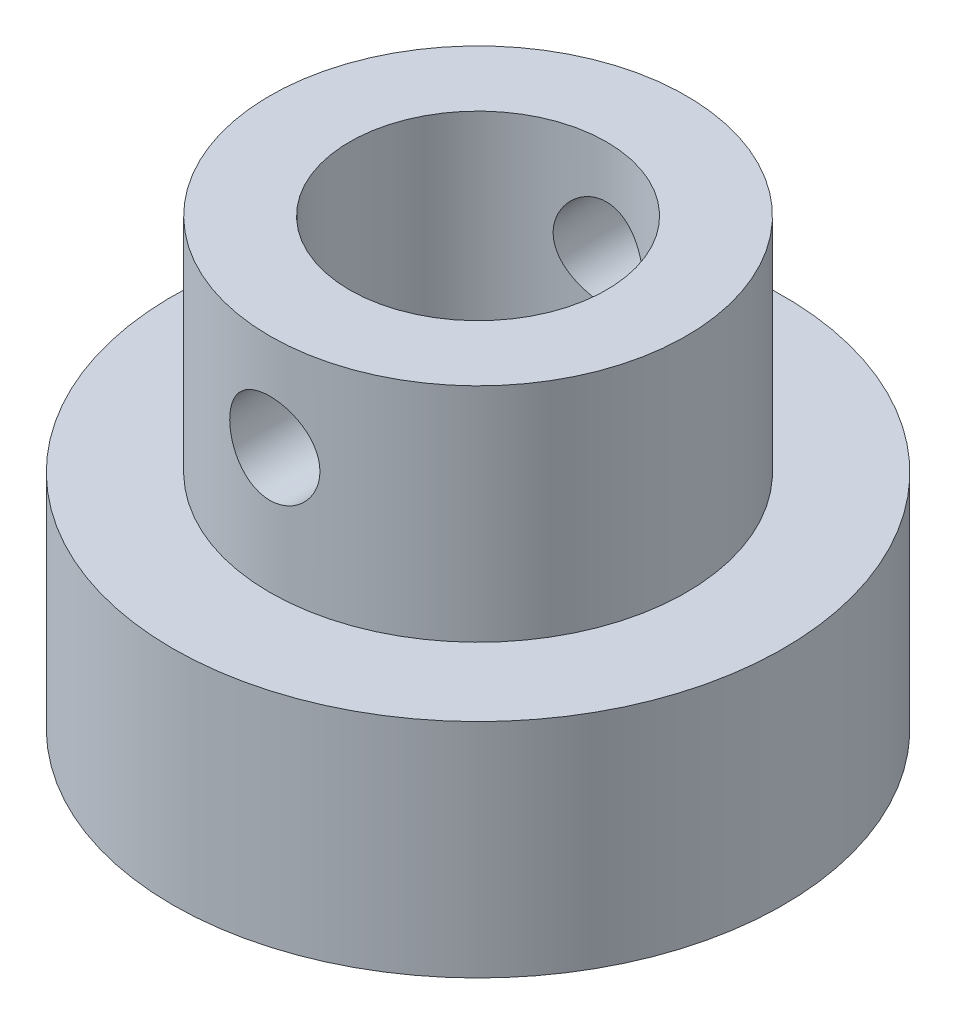
ISO-10303-21;
HEADER;
FILE_DESCRIPTION(('STEP AP214'),'2;1');
FILE_NAME('part.step','',(''),(''),'','','');
FILE_SCHEMA(('AUTOMOTIVE_DESIGN { 1 0 10303 214 1 1 1 1 }'));
ENDSEC;
DATA;
#1=APPLICATION_CONTEXT('core data for automotive mechanical design processes');
#2=APPLICATION_PROTOCOL_DEFINITION('international standard','automotive_design',2000,#1);
#3=PRODUCT_CONTEXT('',#1,'mechanical');
#4=PRODUCT('Part','Part','',(#3));
#5=PRODUCT_RELATED_PRODUCT_CATEGORY('part','',(#4));
#6=PRODUCT_DEFINITION_FORMATION('','',#4);
#7=PRODUCT_DEFINITION_CONTEXT('part definition',#1,'design');
#8=PRODUCT_DEFINITION('design','',#6,#7);
#9=PRODUCT_DEFINITION_SHAPE('','',#8);
#10=(LENGTH_UNIT() NAMED_UNIT(*) SI_UNIT(.MILLI.,.METRE.));
#11=(NAMED_UNIT(*) PLANE_ANGLE_UNIT() SI_UNIT($,.RADIAN.));
#12=(NAMED_UNIT(*) SI_UNIT($,.STERADIAN.) SOLID_ANGLE_UNIT());
#13=UNCERTAINTY_MEASURE_WITH_UNIT(LENGTH_MEASURE(1.E-05),#10,'distance_accuracy_value','');
#14=(GEOMETRIC_REPRESENTATION_CONTEXT(3) GLOBAL_UNCERTAINTY_ASSIGNED_CONTEXT((#13)) GLOBAL_UNIT_ASSIGNED_CONTEXT((#10,
#11,#12)) REPRESENTATION_CONTEXT('',''));
#15=CARTESIAN_POINT('',(0.,0.,0.));
#16=DIRECTION('',(0.,0.,1.));
#17=DIRECTION('',(1.,0.,0.));
#18=AXIS2_PLACEMENT_3D('',#15,#16,#17);
#19=CARTESIAN_POINT('',(0.,8.,0.));
#20=DIRECTION('',(0.,-1.,0.));
#21=DIRECTION('',(0.,0.,-1.));
#22=AXIS2_PLACEMENT_3D('',#19,#20,#21);
#23=CYLINDRICAL_SURFACE('',#22,11.);
#24=CARTESIAN_POINT('',(0.,8.,0.));
#25=DIRECTION('',(0.,1.,0.));
#26=DIRECTION('',(0.,0.,1.));
#27=AXIS2_PLACEMENT_3D('',#24,#25,#26);
#28=CIRCLE('',#27,11.);
#29=CARTESIAN_POINT('',(0.,8.,11.));
#30=VERTEX_POINT('',#29);
#31=EDGE_CURVE('E53',#30,#30,#28,.T.);
#32=ORIENTED_EDGE('',*,*,#31,.F.);
#33=EDGE_LOOP('',(#32));
#34=FACE_BOUND('',#33,.T.);
#35=CARTESIAN_POINT('',(0.,0.,0.));
#36=DIRECTION('',(0.,1.,0.));
#37=DIRECTION('',(0.,0.,1.));
#38=AXIS2_PLACEMENT_3D('',#35,#36,#37);
#39=CIRCLE('',#38,11.);
#40=CARTESIAN_POINT('',(0.,0.,11.));
#41=VERTEX_POINT('',#40);
#42=EDGE_CURVE('E133',#41,#41,#39,.T.);
#43=ORIENTED_EDGE('',*,*,#42,.T.);
#44=EDGE_LOOP('',(#43));
#45=FACE_BOUND('',#44,.T.);
#46=ADVANCED_FACE('F39',(#34,#45),#23,.T.);
#47=CARTESIAN_POINT('',(0.,8.,0.));
#48=DIRECTION('',(0.,1.,0.));
#49=DIRECTION('',(0.,0.,1.));
#50=AXIS2_PLACEMENT_3D('',#47,#48,#49);
#51=PLANE('',#50);
#52=CARTESIAN_POINT('',(0.,8.,0.));
#53=DIRECTION('',(0.,1.,0.));
#54=DIRECTION('',(0.,0.,1.));
#55=AXIS2_PLACEMENT_3D('',#52,#53,#54);
#56=CIRCLE('',#55,7.5);
#57=CARTESIAN_POINT('',(0.,8.,7.5));
#58=VERTEX_POINT('',#57);
#59=EDGE_CURVE('E11',#58,#58,#56,.T.);
#60=ORIENTED_EDGE('',*,*,#59,.F.);
#61=EDGE_LOOP('',(#60));
#62=FACE_BOUND('',#61,.T.);
#63=ORIENTED_EDGE('',*,*,#31,.T.);
#64=EDGE_LOOP('',(#63));
#65=FACE_BOUND('',#64,.T.);
#66=ADVANCED_FACE('F181',(#62,#65),#51,.T.);
#67=CARTESIAN_POINT('',(0.,0.,0.));
#68=DIRECTION('',(0.,1.,0.));
#69=DIRECTION('',(0.,0.,1.));
#70=AXIS2_PLACEMENT_3D('',#67,#68,#69);
#71=PLANE('',#70);
#72=CARTESIAN_POINT('',(0.,0.,8.));
#73=DIRECTION('',(0.,-1.,0.));
#74=DIRECTION('',(0.,0.,-1.));
#75=AXIS2_PLACEMENT_3D('',#72,#73,#74);
#76=CIRCLE('',#75,1.7);
#77=CARTESIAN_POINT('',(0.,0.,6.3));
#78=VERTEX_POINT('',#77);
#79=EDGE_CURVE('E87',#78,#78,#76,.T.);
#80=ORIENTED_EDGE('',*,*,#79,.F.);
#81=EDGE_LOOP('',(#80));
#82=FACE_BOUND('',#81,.T.);
#83=CARTESIAN_POINT('',(-8.,0.,0.));
#84=DIRECTION('',(0.,-1.,0.));
#85=DIRECTION('',(0.,0.,-1.));
#86=AXIS2_PLACEMENT_3D('',#83,#84,#85);
#87=CIRCLE('',#86,1.7);
#88=CARTESIAN_POINT('',(-8.,0.,-1.7));
#89=VERTEX_POINT('',#88);
#90=EDGE_CURVE('E78',#89,#89,#87,.T.);
#91=ORIENTED_EDGE('',*,*,#90,.F.);
#92=EDGE_LOOP('',(#91));
#93=FACE_BOUND('',#92,.T.);
#94=CARTESIAN_POINT('',(0.,0.,-8.));
#95=DIRECTION('',(0.,-1.,0.));
#96=DIRECTION('',(0.,0.,-1.));
#97=AXIS2_PLACEMENT_3D('',#94,#95,#96);
#98=CIRCLE('',#97,1.7);
#99=CARTESIAN_POINT('',(0.,0.,-9.7));
#100=VERTEX_POINT('',#99);
#101=EDGE_CURVE('E98',#100,#100,#98,.T.);
#102=ORIENTED_EDGE('',*,*,#101,.F.);
#103=EDGE_LOOP('',(#102));
#104=FACE_BOUND('',#103,.T.);
#105=CARTESIAN_POINT('',(8.,0.,0.));
#106=DIRECTION('',(0.,-1.,0.));
#107=DIRECTION('',(0.,0.,-1.));
#108=AXIS2_PLACEMENT_3D('',#105,#106,#107);
#109=CIRCLE('',#108,1.7);
#110=CARTESIAN_POINT('',(8.,0.,-1.7));
#111=VERTEX_POINT('',#110);
#112=EDGE_CURVE('E110',#111,#111,#109,.T.);
#113=ORIENTED_EDGE('',*,*,#112,.F.);
#114=EDGE_LOOP('',(#113));
#115=FACE_BOUND('',#114,.T.);
#116=ORIENTED_EDGE('',*,*,#42,.F.);
#117=EDGE_LOOP('',(#116));
#118=FACE_BOUND('',#117,.T.);
#119=ADVANCED_FACE('F179',(#82,#93,#104,#115,#118),#71,.F.);
#120=CARTESIAN_POINT('',(0.,16.,0.));
#121=DIRECTION('',(0.,-1.,0.));
#122=DIRECTION('',(0.,0.,-1.));
#123=AXIS2_PLACEMENT_3D('',#120,#121,#122);
#124=CYLINDRICAL_SURFACE('',#123,7.5);
#125=CARTESIAN_POINT('',(0.,14.125,-7.5));
#126=CARTESIAN_POINT('',(-0.0901479540247242,14.1249968923104,-7.49999833465286));
#127=CARTESIAN_POINT('',(-0.180333653524648,14.1174731454035,-7.49835813423914));
#128=CARTESIAN_POINT('',(-0.358144782911639,14.0876073508536,-7.49197344979723));
#129=CARTESIAN_POINT('',(-0.445768312005207,14.0652545793368,-7.48722671925988));
#130=CARTESIAN_POINT('',(-0.615859531046939,14.0064625843428,-7.47515766036674));
#131=CARTESIAN_POINT('',(-0.698332453767545,13.9700379368545,-7.4678379978208));
#132=CARTESIAN_POINT('',(-0.855993155396568,13.8841820792907,-7.45141372270704));
#133=CARTESIAN_POINT('',(-0.931181150421449,13.8347512552215,-7.44230916311466));
#134=CARTESIAN_POINT('',(-1.07332604077453,13.7234615017073,-7.42315255638508));
#135=CARTESIAN_POINT('',(-1.14015165968553,13.6614368758258,-7.41308894175801));
#136=CARTESIAN_POINT('',(-1.26253675838003,13.5270759447585,-7.39323026224726));
#137=CARTESIAN_POINT('',(-1.31809524854413,13.4547387347426,-7.38343522101833));
#138=CARTESIAN_POINT('',(-1.41694586085904,13.3008383958286,-7.36510879581594));
#139=CARTESIAN_POINT('',(-1.46009866490761,13.2191838590649,-7.35659224138259));
#140=CARTESIAN_POINT('',(-1.53201942872996,13.0495672254001,-7.34195290175129));
#141=CARTESIAN_POINT('',(-1.56078907387586,12.9616058688936,-7.33582983611039));
#142=CARTESIAN_POINT('',(-1.60269387288556,12.7832952251765,-7.32678847076681));
#143=CARTESIAN_POINT('',(-1.61606121788145,12.6930029671636,-7.3238226291454));
#144=CARTESIAN_POINT('',(-1.62750384878042,12.5114124403141,-7.3212886947931));
#145=CARTESIAN_POINT('',(-1.62558097786447,12.4201142940588,-7.32172019252502));
#146=CARTESIAN_POINT('',(-1.60668471401318,12.2408266257476,-7.32588912430294));
#147=CARTESIAN_POINT('',(-1.58998064472992,12.1528071342021,-7.32956739690384));
#148=CARTESIAN_POINT('',(-1.54242266223009,11.9808502530296,-7.33972193616241));
#149=CARTESIAN_POINT('',(-1.51156796851897,11.8969130888508,-7.34619835715415));
#150=CARTESIAN_POINT('',(-1.43633617080431,11.734744232766,-7.36127801218712));
#151=CARTESIAN_POINT('',(-1.39185514512697,11.6565623246642,-7.36989749168467));
#152=CARTESIAN_POINT('',(-1.29070643673813,11.5086724696205,-7.38828204920645));
#153=CARTESIAN_POINT('',(-1.23403712235219,11.4389656592172,-7.39804728053552));
#154=CARTESIAN_POINT('',(-1.10869294700727,11.3084537375133,-7.41787716607823));
#155=CARTESIAN_POINT('',(-1.03978897288967,11.2478687515638,-7.42794377839477));
#156=CARTESIAN_POINT('',(-0.892685343979342,11.1390788160031,-7.44705346585474));
#157=CARTESIAN_POINT('',(-0.814485526906435,11.090874082564,-7.45609652312429));
#158=CARTESIAN_POINT('',(-0.650744094858933,11.0081601843631,-7.47216868583004));
#159=CARTESIAN_POINT('',(-0.565187684503572,10.9736794432215,-7.47919360323694));
#160=CARTESIAN_POINT('',(-0.389309359280253,10.9196446170939,-7.49040677210774));
#161=CARTESIAN_POINT('',(-0.29898812608197,10.9000884031188,-7.49459542815571));
#162=CARTESIAN_POINT('',(-0.118032605514446,10.8767769569225,-7.49960668074752));
#163=CARTESIAN_POINT('',(-0.0274387859048244,10.8727209690694,-7.50049333820621));
#164=CARTESIAN_POINT('',(0.153131946389313,10.8797105205614,-7.49898002686768));
#165=CARTESIAN_POINT('',(0.24310889969126,10.8907550558289,-7.49658027659322));
#166=CARTESIAN_POINT('',(0.41889827958432,10.9273826917776,-7.48880417809933));
#167=CARTESIAN_POINT('',(0.504745045285521,10.9528084357412,-7.48346006275669));
#168=CARTESIAN_POINT('',(0.670955437352065,11.0173023954218,-7.47039323254991));
#169=CARTESIAN_POINT('',(0.751318601981769,11.0563717582821,-7.46267031768488));
#170=CARTESIAN_POINT('',(0.905527035036078,11.1476732875241,-7.44554432718735));
#171=CARTESIAN_POINT('',(0.979264892547599,11.2000826384609,-7.43611917472359));
#172=CARTESIAN_POINT('',(1.11700721488751,11.316342669268,-7.41667999768088));
#173=CARTESIAN_POINT('',(1.18101043901943,11.3801948052865,-7.40666589826476));
#174=CARTESIAN_POINT('',(1.29865253183392,11.5189067808595,-7.38695681521904));
#175=CARTESIAN_POINT('',(1.35208333703318,11.5939445985842,-7.37727086146894));
#176=CARTESIAN_POINT('',(1.44558524361963,11.7521054284889,-7.35952154796309));
#177=CARTESIAN_POINT('',(1.4856569192304,11.8352280929546,-7.35145811847132));
#178=CARTESIAN_POINT('',(1.55103509163125,12.0067555352912,-7.33794287614403));
#179=CARTESIAN_POINT('',(1.57642400202934,12.0951276985389,-7.33247651761262));
#180=CARTESIAN_POINT('',(1.61195844891764,12.2750172805246,-7.32474755019285));
#181=CARTESIAN_POINT('',(1.62210637050298,12.3665342048388,-7.32248444002445));
#182=CARTESIAN_POINT('',(1.62677075530336,12.5480186851911,-7.3214493720842));
#183=CARTESIAN_POINT('',(1.62161697678218,12.6379775033783,-7.32260376409825));
#184=CARTESIAN_POINT('',(1.59656038496706,12.815712333774,-7.32810729341865));
#185=CARTESIAN_POINT('',(1.57665773876875,12.9034883707003,-7.3324563945309));
#186=CARTESIAN_POINT('',(1.52282633194366,13.0741099996105,-7.34382373878036));
#187=CARTESIAN_POINT('',(1.4889447033154,13.1569710993366,-7.35083300650847));
#188=CARTESIAN_POINT('',(1.40815791883712,13.3158820491978,-7.36673460516187));
#189=CARTESIAN_POINT('',(1.36125143558819,13.3919312040635,-7.37562712799295));
#190=CARTESIAN_POINT('',(1.2546489870959,13.5366869780595,-7.39451389328671));
#191=CARTESIAN_POINT('',(1.19471765092078,13.6052178999174,-7.40452649979151));
#192=CARTESIAN_POINT('',(1.0642447649264,13.7313583997511,-7.42440093275769));
#193=CARTESIAN_POINT('',(0.993700768039403,13.7889654519575,-7.43426272386478));
#194=CARTESIAN_POINT('',(0.84292761338998,13.8923210921052,-7.45287255955798));
#195=CARTESIAN_POINT('',(0.762587011653083,13.9379100890078,-7.46160489997197));
#196=CARTESIAN_POINT('',(0.595211940972629,14.0148652197655,-7.47681476384854));
#197=CARTESIAN_POINT('',(0.508183207342466,14.0462433841878,-7.48329419349057));
#198=CARTESIAN_POINT('',(0.350878919189541,14.0882382204436,-7.49210029764606));
#199=CARTESIAN_POINT('',(0.281459740955777,14.1019977844806,-7.49504445374658));
#200=CARTESIAN_POINT('',(0.141368077133739,14.1203796974869,-7.49899491649603));
#201=CARTESIAN_POINT('',(0.0706956452593545,14.125002437106,-7.50000130599515));
#202=CARTESIAN_POINT('',(0.,14.125,-7.5));
#203=B_SPLINE_CURVE_WITH_KNOTS('',3,(#125,#126,#127,#128,#129,#130,#131,#132,#133,#134,#135,
#136,#137,#138,#139,#140,#141,#142,#143,#144,#145,#146,#147,#148,#149,#150,#151,#152,#153,#154,
#155,#156,#157,#158,#159,#160,#161,#162,#163,#164,#165,#166,#167,#168,#169,#170,#171,#172,#173,
#174,#175,#176,#177,#178,#179,#180,#181,#182,#183,#184,#185,#186,#187,#188,#189,#190,#191,#192,
#193,#194,#195,#196,#197,#198,#199,#200,#201,#202),.UNSPECIFIED.,.T.,.F.,(4,2,2,2,2,2,2,2,2,2,2,
2,2,2,2,2,2,2,2,2,2,2,2,2,2,2,2,2,2,2,2,2,2,2,2,2,2,2,4),(0.,0.270185104747787,
0.540565811976368,0.8106672000257,1.08076057272556,1.35466930002996,1.62860207499659,
1.90550066624898,2.18236680380904,2.45500217917843,2.7276046898245,2.99534017891215,
3.26309043704611,3.53293580122647,3.80281731274124,4.07842213995422,4.35403177918597,
4.63020929700403,4.90634741063436,5.17709949540208,5.44783357795425,5.71566110213552,
5.98351115043831,6.25512359403709,6.52677062617235,6.80332376875751,7.07986502255779,
7.35483861007376,7.62976916189603,7.89881814654413,8.16786408307853,8.43601021382995,
8.70418368212996,8.97767995016378,9.25123937790989,9.52826678977587,9.80505923612806,
10.016952309559,10.2288363231926),.UNSPECIFIED.);
#204=CARTESIAN_POINT('',(0.,14.125,-7.5));
#205=VERTEX_POINT('',#204);
#206=EDGE_CURVE('E42',#205,#205,#203,.T.);
#207=ORIENTED_EDGE('',*,*,#206,.T.);
#208=EDGE_LOOP('',(#207));
#209=FACE_BOUND('',#208,.T.);
#210=CARTESIAN_POINT('',(-1.625,12.5,7.32184232280374));
#211=CARTESIAN_POINT('',(-1.62499687209214,12.5901199556067,7.32184414375208));
#212=CARTESIAN_POINT('',(-1.61747763928133,12.6802777072396,7.32352428607456));
#213=CARTESIAN_POINT('',(-1.58763139826009,12.8580308212321,7.33005125182243));
#214=CARTESIAN_POINT('',(-1.56529355435126,12.9456242595347,7.33490039245132));
#215=CARTESIAN_POINT('',(-1.50654519463478,13.1156517233168,7.34719096792699));
#216=CARTESIAN_POINT('',(-1.47014995445549,13.1980912367735,7.35462958802347));
#217=CARTESIAN_POINT('',(-1.38436343523498,13.3556955272207,7.37125759440614));
#218=CARTESIAN_POINT('',(-1.3349724756991,13.4308604829972,7.38044693764852));
#219=CARTESIAN_POINT('',(-1.22372374982819,13.5730295804188,7.39971118281315));
#220=CARTESIAN_POINT('',(-1.16169132615172,13.6398955641599,7.40979723204462));
#221=CARTESIAN_POINT('',(-1.02729762080912,13.7623590830841,7.42962079535388));
#222=CARTESIAN_POINT('',(-0.954935546298752,13.8179557525065,7.43935828260625));
#223=CARTESIAN_POINT('',(-0.801011635174219,13.9168477758399,7.45750883541628));
#224=CARTESIAN_POINT('',(-0.719362661039211,13.9600104287561,7.46590721513039));
#225=CARTESIAN_POINT('',(-0.549758031104518,14.0319509127924,7.48030744520595));
#226=CARTESIAN_POINT('',(-0.461803070725259,14.060730327306,7.4863095593481));
#227=CARTESIAN_POINT('',(-0.283519405794788,14.1026533711496,7.49516221130164));
#228=CARTESIAN_POINT('',(-0.19324804760359,14.1160307668407,7.49805981981853));
#229=CARTESIAN_POINT('',(-0.0116989907791744,14.1275007517177,7.50054000524574));
#230=CARTESIAN_POINT('',(0.0795785936471376,14.1255950580587,7.50012295457977));
#231=CARTESIAN_POINT('',(0.258938141487593,14.106727429218,7.49605684280341));
#232=CARTESIAN_POINT('',(0.34704801518035,14.0900174455468,7.49246186845644));
#233=CARTESIAN_POINT('',(0.519182539878094,14.0424168515449,7.48250539784684));
#234=CARTESIAN_POINT('',(0.603207008276534,14.0115256079936,7.47614377804881));
#235=CARTESIAN_POINT('',(0.765487195860258,13.9362153238536,7.46128158969121));
#236=CARTESIAN_POINT('',(0.843696987273928,13.8917004152657,7.45276593964814));
#237=CARTESIAN_POINT('',(0.99162854432123,13.7904778401247,7.43452999336579));
#238=CARTESIAN_POINT('',(1.06134917195807,13.7337685416908,7.42480953597031));
#239=CARTESIAN_POINT('',(1.19182140210426,13.6083940626952,7.40499910922728));
#240=CARTESIAN_POINT('',(1.25236076193675,13.5395083704295,7.39490564770127));
#241=CARTESIAN_POINT('',(1.36106708879127,13.392458210296,7.37567304351349));
#242=CARTESIAN_POINT('',(1.40923373303013,13.3142935004323,7.36653392575261));
#243=CARTESIAN_POINT('',(1.49191924639667,13.150565349079,7.35023580998224));
#244=CARTESIAN_POINT('',(1.52639866246812,13.0649813733747,7.34308255372838));
#245=CARTESIAN_POINT('',(1.58042258184931,12.889042607875,7.33164612434379));
#246=CARTESIAN_POINT('',(1.5999694052511,12.7986885615435,7.32736250536733));
#247=CARTESIAN_POINT('',(1.62324543647323,12.6177120345439,7.32224110981487));
#248=CARTESIAN_POINT('',(1.62728339582283,12.5271311204803,7.32133608237376));
#249=CARTESIAN_POINT('',(1.62026240642683,12.3465903681749,7.32289302987793));
#250=CARTESIAN_POINT('',(1.60920447383651,12.2566304885388,7.32535477819421));
#251=CARTESIAN_POINT('',(1.57257328406887,12.0809562396314,7.33330445424626));
#252=CARTESIAN_POINT('',(1.54716950166002,11.9952047846305,7.33875702865016));
#253=CARTESIAN_POINT('',(1.48275097137457,11.8291754097126,7.35204219861836));
#254=CARTESIAN_POINT('',(1.44373494087958,11.7488980064422,7.35987501845305));
#255=CARTESIAN_POINT('',(1.35251707971616,11.5947576898493,7.37718625172041));
#256=CARTESIAN_POINT('',(1.30012471092914,11.5210101813298,7.38668776621061));
#257=CARTESIAN_POINT('',(1.18389124648282,11.3832406152174,7.40620460560324));
#258=CARTESIAN_POINT('',(1.12004875703517,11.3192197433728,7.41621999295177));
#259=CARTESIAN_POINT('',(0.981331413697757,11.2015255245566,7.43585739156174));
#260=CARTESIAN_POINT('',(0.906276389126764,11.1480624792713,7.44546887979737));
#261=CARTESIAN_POINT('',(0.74807118723432,11.0545040368504,7.46302313313436));
#262=CARTESIAN_POINT('',(0.664921384330292,11.014408021813,7.47096597536398));
#263=CARTESIAN_POINT('',(0.493399922527268,10.9490162573277,7.48424355636439));
#264=CARTESIAN_POINT('',(0.405064938092908,10.9236277723561,7.48959460133612));
#265=CARTESIAN_POINT('',(0.225254895334082,10.888081634183,7.49715611089188));
#266=CARTESIAN_POINT('',(0.133780286375393,10.8779218105674,7.49936702301052));
#267=CARTESIAN_POINT('',(-0.0477145653661606,10.873217446055,7.50038617714046));
#268=CARTESIAN_POINT('',(-0.13772642281868,10.878358672771,7.49926289364016));
#269=CARTESIAN_POINT('',(-0.315570717122539,10.9034086285368,7.49388626533173));
#270=CARTESIAN_POINT('',(-0.403403191702777,10.9233171017554,7.48963297474859));
#271=CARTESIAN_POINT('',(-0.574157800182041,10.9771870401124,7.47847894809863));
#272=CARTESIAN_POINT('',(-0.657094324974581,11.0111047077401,7.47158646789262));
#273=CARTESIAN_POINT('',(-0.816141464560759,11.0919872321336,7.45589075741551));
#274=CARTESIAN_POINT('',(-0.892251429341775,11.1389533296062,7.44708734546135));
#275=CARTESIAN_POINT('',(-1.03702016526194,11.2456281807887,7.42832569731547));
#276=CARTESIAN_POINT('',(-1.10551339879053,11.3055583560667,7.418348977639));
#277=CARTESIAN_POINT('',(-1.23157840728762,11.4360125681303,7.39846585871692));
#278=CARTESIAN_POINT('',(-1.28914755197976,11.5065391489877,7.38855947695841));
#279=CARTESIAN_POINT('',(-1.39245374978007,11.6572920448323,7.36979460227812));
#280=CARTESIAN_POINT('',(-1.43802639033545,11.737633048104,7.36095149094263));
#281=CARTESIAN_POINT('',(-1.51495083643342,11.905007191765,7.34550714239166));
#282=CARTESIAN_POINT('',(-1.54631477727316,11.9920345469142,7.33890399329569));
#283=CARTESIAN_POINT('',(-1.58827656632666,12.1493028810386,7.32991922087132));
#284=CARTESIAN_POINT('',(-1.6020216496014,12.2186854639203,7.3269103320858));
#285=CARTESIAN_POINT('',(-1.62038437850148,12.3587043254918,7.32287121561378));
#286=CARTESIAN_POINT('',(-1.62500245246751,12.42934054519,7.32184089507093));
#287=CARTESIAN_POINT('',(-1.625,12.5,7.32184232280374));
#288=B_SPLINE_CURVE_WITH_KNOTS('',3,(#210,#211,#212,#213,#214,#215,#216,#217,#218,#219,#220,
#221,#222,#223,#224,#225,#226,#227,#228,#229,#230,#231,#232,#233,#234,#235,#236,#237,#238,#239,
#240,#241,#242,#243,#244,#245,#246,#247,#248,#249,#250,#251,#252,#253,#254,#255,#256,#257,#258,
#259,#260,#261,#262,#263,#264,#265,#266,#267,#268,#269,#270,#271,#272,#273,#274,#275,#276,#277,
#278,#279,#280,#281,#282,#283,#284,#285,#286,#287),.UNSPECIFIED.,.T.,.F.,(4,2,2,2,2,2,2,2,2,2,2,
2,2,2,2,2,2,2,2,2,2,2,2,2,2,2,2,2,2,2,2,2,2,2,2,2,2,2,4),(0.,0.270100933639585,
0.540399589117663,0.81040534414459,1.0804044615842,1.35442330510247,1.62846319204188,
1.90532771132165,2.18216174497129,2.45473627707221,2.727280184069,2.99527295394262,
3.26327769137584,3.53321348178312,3.80318541811235,4.07867071434198,4.35416319678653,
4.6304441107928,4.90668209001818,5.17739130544218,5.44808229941638,5.71564044210779,
5.98322380236158,6.25485499432266,6.52651927359209,6.80314434725372,7.07975663192012,
7.35460525468541,7.6294147018405,7.89861968626967,8.16782000703734,8.4361850108691,
8.70457554086096,8.97797416466241,9.25143853344364,9.52847570509277,9.80527581803337,
10.0170611028616,10.2288364481351),.UNSPECIFIED.);
#289=CARTESIAN_POINT('',(-1.625,12.5,7.32184232280374));
#290=VERTEX_POINT('',#289);
#291=EDGE_CURVE('E148',#290,#290,#288,.T.);
#292=ORIENTED_EDGE('',*,*,#291,.T.);
#293=EDGE_LOOP('',(#292));
#294=FACE_BOUND('',#293,.T.);
#295=CARTESIAN_POINT('',(0.,16.,0.));
#296=DIRECTION('',(0.,1.,0.));
#297=DIRECTION('',(0.,0.,1.));
#298=AXIS2_PLACEMENT_3D('',#295,#296,#297);
#299=CIRCLE('',#298,7.5);
#300=CARTESIAN_POINT('',(0.,16.,7.5));
#301=VERTEX_POINT('',#300);
#302=EDGE_CURVE('E127',#301,#301,#299,.T.);
#303=ORIENTED_EDGE('',*,*,#302,.F.);
#304=EDGE_LOOP('',(#303));
#305=FACE_BOUND('',#304,.T.);
#306=ORIENTED_EDGE('',*,*,#59,.T.);
#307=EDGE_LOOP('',(#306));
#308=FACE_BOUND('',#307,.T.);
#309=ADVANCED_FACE('F174',(#209,#294,#305,#308),#124,.T.);
#310=CARTESIAN_POINT('',(0.,16.,0.));
#311=DIRECTION('',(0.,1.,0.));
#312=DIRECTION('',(0.,0.,1.));
#313=AXIS2_PLACEMENT_3D('',#310,#311,#312);
#314=PLANE('',#313);
#315=CARTESIAN_POINT('',(0.,16.,0.));
#316=DIRECTION('',(0.,1.,0.));
#317=DIRECTION('',(0.,0.,1.));
#318=AXIS2_PLACEMENT_3D('',#315,#316,#317);
#319=CIRCLE('',#318,4.625);
#320=CARTESIAN_POINT('',(0.,16.,4.625));
#321=VERTEX_POINT('',#320);
#322=EDGE_CURVE('E122',#321,#321,#319,.T.);
#323=ORIENTED_EDGE('',*,*,#322,.F.);
#324=EDGE_LOOP('',(#323));
#325=FACE_BOUND('',#324,.T.);
#326=ORIENTED_EDGE('',*,*,#302,.T.);
#327=EDGE_LOOP('',(#326));
#328=FACE_BOUND('',#327,.T.);
#329=ADVANCED_FACE('F178',(#325,#328),#314,.T.);
#330=CARTESIAN_POINT('',(0.,8.,0.));
#331=DIRECTION('',(0.,1.,0.));
#332=DIRECTION('',(0.,0.,1.));
#333=AXIS2_PLACEMENT_3D('',#330,#331,#332);
#334=CYLINDRICAL_SURFACE('',#333,4.625);
#335=CARTESIAN_POINT('',(1.625,12.5,-4.33012701892219));
#336=CARTESIAN_POINT('',(1.62500150829733,12.4118027863263,-4.33012573284073));
#337=CARTESIAN_POINT('',(1.61779548336245,12.3236160731502,-4.33285104282251));
#338=CARTESIAN_POINT('',(1.58927299575478,12.149874885696,-4.3433930621808));
#339=CARTESIAN_POINT('',(1.56795545162227,12.0643206136853,-4.35121016177433));
#340=CARTESIAN_POINT('',(1.51206700335383,11.8983936526935,-4.37094334062911));
#341=CARTESIAN_POINT('',(1.47752444467068,11.8180103082039,-4.38285064768964));
#342=CARTESIAN_POINT('',(1.39626497313055,11.664150970291,-4.40940926548112));
#343=CARTESIAN_POINT('',(1.34954493280841,11.5906767579021,-4.42406128084572));
#344=CARTESIAN_POINT('',(1.24307820181164,11.4495229988598,-4.45517344672579));
#345=CARTESIAN_POINT('',(1.18288940085755,11.3821875421975,-4.4716821892838));
#346=CARTESIAN_POINT('',(1.05213491319957,11.2583281251141,-4.50423928506704));
#347=CARTESIAN_POINT('',(0.981567347426518,11.2018061267355,-4.52028755429374));
#348=CARTESIAN_POINT('',(0.82950227710956,11.0995768954727,-4.55068434918393));
#349=CARTESIAN_POINT('',(0.74774473132286,11.0542358402988,-4.56496914900983));
#350=CARTESIAN_POINT('',(0.577173587360306,10.9780897413938,-4.58965216808301));
#351=CARTESIAN_POINT('',(0.488362126347126,10.9472803144174,-4.60005155910798));
#352=CARTESIAN_POINT('',(0.309816097877116,10.9022555183571,-4.61544755230239));
#353=CARTESIAN_POINT('',(0.220247335749104,10.887449470965,-4.6206359300531));
#354=CARTESIAN_POINT('',(0.039756348707931,10.8729675177362,-4.62570919054418));
#355=CARTESIAN_POINT('',(-0.0511654819801261,10.873287287953,-4.62559558893667));
#356=CARTESIAN_POINT('',(-0.227578769223165,10.8886860433862,-4.62020432989997));
#357=CARTESIAN_POINT('',(-0.313134365157233,10.9031221887032,-4.61515159697674));
#358=CARTESIAN_POINT('',(-0.48052073596718,10.9452732071685,-4.60073748556916));
#359=CARTESIAN_POINT('',(-0.56235125188061,10.9729890019609,-4.59137580803404));
#360=CARTESIAN_POINT('',(-0.721300530579032,11.0412548831078,-4.56912305860148));
#361=CARTESIAN_POINT('',(-0.79833850377761,11.0819771222662,-4.55618497777778));
#362=CARTESIAN_POINT('',(-0.944668447950634,11.1749540180038,-4.52811063452626));
#363=CARTESIAN_POINT('',(-1.01395809737558,11.2272121170788,-4.51297371639026));
#364=CARTESIAN_POINT('',(-1.14663532629142,11.3449583839262,-4.48115483226846));
#365=CARTESIAN_POINT('',(-1.20952949469725,11.4109927000639,-4.46443345217924));
#366=CARTESIAN_POINT('',(-1.3235221092173,11.5527976907646,-4.4319787221418));
#367=CARTESIAN_POINT('',(-1.37461829262161,11.6285702286697,-4.41624556214265));
#368=CARTESIAN_POINT('',(-1.46435277059678,11.7894229226137,-4.38731873128432));
#369=CARTESIAN_POINT('',(-1.50275910964837,11.8746419583107,-4.37417394984031));
#370=CARTESIAN_POINT('',(-1.56450027209022,12.050918702227,-4.35247603204309));
#371=CARTESIAN_POINT('',(-1.58784226395531,12.1419736106952,-4.34392071209017));
#372=CARTESIAN_POINT('',(-1.61773856551961,12.3225145245676,-4.33287316706974));
#373=CARTESIAN_POINT('',(-1.62506609618441,12.4118553792491,-4.33010198886669));
#374=CARTESIAN_POINT('',(-1.62493304045104,12.5905138882046,-4.33015237293203));
#375=CARTESIAN_POINT('',(-1.61747553775005,12.6798315434314,-4.33297276897228));
#376=CARTESIAN_POINT('',(-1.58868179004291,12.8522090440491,-4.3436081454417));
#377=CARTESIAN_POINT('',(-1.56790735420756,12.9353766050932,-4.35122073126549));
#378=CARTESIAN_POINT('',(-1.51375717651186,13.0970204703768,-4.37035273497134));
#379=CARTESIAN_POINT('',(-1.48037904951589,13.1754958834112,-4.38187289228429));
#380=CARTESIAN_POINT('',(-1.40067357955318,13.3285135222489,-4.40800977309429));
#381=CARTESIAN_POINT('',(-1.35394153478346,13.402828677838,-4.42271911494206));
#382=CARTESIAN_POINT('',(-1.24930133840496,13.5428399851722,-4.45340766086769));
#383=CARTESIAN_POINT('',(-1.19138954758122,13.6085333186247,-4.46938727744453));
#384=CARTESIAN_POINT('',(-1.0622985721696,13.7331353349432,-4.50186689221156));
#385=CARTESIAN_POINT('',(-0.990569064615989,13.7914806054164,-4.51834791696491));
#386=CARTESIAN_POINT('',(-0.837930397044871,13.8953557719718,-4.54912635757182));
#387=CARTESIAN_POINT('',(-0.757021439586266,13.940885950762,-4.56342382159271));
#388=CARTESIAN_POINT('',(-0.588599426354339,14.01745899056,-4.58817739365169));
#389=CARTESIAN_POINT('',(-0.501125646300484,14.048581097407,-4.59865444499624));
#390=CARTESIAN_POINT('',(-0.321739492001587,14.0955233809401,-4.61467247734998));
#391=CARTESIAN_POINT('',(-0.22982893557763,14.1113497695954,-4.62021546213327));
#392=CARTESIAN_POINT('',(-0.0493045944378566,14.1266445657859,-4.62557313865554));
#393=CARTESIAN_POINT('',(0.039233307935331,14.1269179383006,-4.62566971347605));
#394=CARTESIAN_POINT('',(0.215035401967487,14.1131202441142,-4.62083489224877));
#395=CARTESIAN_POINT('',(0.302299716146434,14.0990505665733,-4.61590398312535));
#396=CARTESIAN_POINT('',(0.471387976522467,14.0575156145694,-4.60168299615926));
#397=CARTESIAN_POINT('',(0.55328434531012,14.0303136361436,-4.59247873038462));
#398=CARTESIAN_POINT('',(0.711372937040097,13.9635370547998,-4.57066166806));
#399=CARTESIAN_POINT('',(0.787564094471202,13.9239601478354,-4.55804823682826));
#400=CARTESIAN_POINT('',(0.935353363106007,13.8317732870271,-4.53007941210145));
#401=CARTESIAN_POINT('',(1.00665289573363,13.7787118899912,-4.51463567543478));
#402=CARTESIAN_POINT('',(1.13959348823396,13.6618057728079,-4.48292657581442));
#403=CARTESIAN_POINT('',(1.20123128562237,13.5979574252808,-4.46666093776994));
#404=CARTESIAN_POINT('',(1.31592123536035,13.4578778385029,-4.43426319908982));
#405=CARTESIAN_POINT('',(1.36846509454748,13.3812200170416,-4.41816972071051));
#406=CARTESIAN_POINT('',(1.45990963153282,13.2196536224754,-4.38880458419607));
#407=CARTESIAN_POINT('',(1.49881191872771,13.1347460241679,-4.37553259326208));
#408=CARTESIAN_POINT('',(1.56136713686403,12.959696668832,-4.35360276246166));
#409=CARTESIAN_POINT('',(1.58514296626991,12.8696037541438,-4.34490783768646));
#410=CARTESIAN_POINT('',(1.61695499172734,12.686335698566,-4.33317194173853));
#411=CARTESIAN_POINT('',(1.62499840679793,12.5931619913058,-4.33012837739947));
#412=CARTESIAN_POINT('',(1.625,12.5,-4.33012701892219));
#413=B_SPLINE_CURVE_WITH_KNOTS('',3,(#335,#336,#337,#338,#339,#340,#341,#342,#343,#344,#345,
#346,#347,#348,#349,#350,#351,#352,#353,#354,#355,#356,#357,#358,#359,#360,#361,#362,#363,#364,
#365,#366,#367,#368,#369,#370,#371,#372,#373,#374,#375,#376,#377,#378,#379,#380,#381,#382,#383,
#384,#385,#386,#387,#388,#389,#390,#391,#392,#393,#394,#395,#396,#397,#398,#399,#400,#401,#402,
#403,#404,#405,#406,#407,#408,#409,#410,#411,#412),.UNSPECIFIED.,.T.,.F.,(4,2,2,2,2,2,2,2,2,2,2,
2,2,2,2,2,2,2,2,2,2,2,2,2,2,2,2,2,2,2,2,2,2,2,2,2,2,2,4),(0.,0.264245837452711,0.52851192816904,
0.792214754247278,1.05598537229117,1.33018771862669,1.60443977038437,1.8867425756752,
2.16896017406029,2.44036249486301,2.7116872316253,2.97120550813731,3.23074179853756,
3.4938665235483,3.75706987583152,4.03394261336656,4.31086840769761,4.59260723212708,
4.87421189012317,5.14188831318889,5.40950891316822,5.66652218607347,5.92358412083283,
6.18945876398179,6.45542010064761,6.7358481529141,7.01627001830062,7.29513065503165,
7.57387799191529,7.83818455852746,8.10246552882103,8.36165497378583,8.62089270513021,
8.89032816299377,9.1598544062153,9.4414544076357,9.72302117544445,10.0022700468936,
10.2813907513464),.UNSPECIFIED.);
#414=CARTESIAN_POINT('',(1.625,12.5,-4.33012701892219));
#415=VERTEX_POINT('',#414);
#416=EDGE_CURVE('E149',#415,#415,#413,.T.);
#417=ORIENTED_EDGE('',*,*,#416,.T.);
#418=EDGE_LOOP('',(#417));
#419=FACE_BOUND('',#418,.T.);
#420=CARTESIAN_POINT('',(0.,10.875,4.625));
#421=CARTESIAN_POINT('',(0.0883877325388629,10.8749985421762,4.6250010281741));
#422=CARTESIAN_POINT('',(0.176765053436674,10.8822345529301,4.6224434236109));
#423=CARTESIAN_POINT('',(0.350900175895998,10.9108869950838,4.61249401019552));
#424=CARTESIAN_POINT('',(0.436657986904093,10.9323033753394,4.60510221877873));
#425=CARTESIAN_POINT('',(0.603018513085195,10.9884803629309,4.58628357271038));
#426=CARTESIAN_POINT('',(0.683630114752264,11.0232171991101,4.57486390893483));
#427=CARTESIAN_POINT('',(0.837880828690709,11.1049359297864,4.54914313038684));
#428=CARTESIAN_POINT('',(0.911518334312613,11.1519206365634,4.53484135401303));
#429=CARTESIAN_POINT('',(1.05252676209618,11.2586709895661,4.50424228642389));
#430=CARTESIAN_POINT('',(1.11959687219141,11.3188190980072,4.48789344365499));
#431=CARTESIAN_POINT('',(1.24293329501787,11.4493764279269,4.45531354339639));
#432=CARTESIAN_POINT('',(1.29919686067978,11.519788250505,4.43908251686238));
#433=CARTESIAN_POINT('',(1.40112094810134,11.6716786193375,4.40799536965322));
#434=CARTESIAN_POINT('',(1.44637632663152,11.7534429688991,4.39320126763134));
#435=CARTESIAN_POINT('',(1.52236246939645,11.9240253807665,4.36745452770202));
#436=CARTESIAN_POINT('',(1.5530982330494,12.0128410028448,4.3565005678859));
#437=CARTESIAN_POINT('',(1.59801916859705,12.1915641350614,4.34022062346786));
#438=CARTESIAN_POINT('',(1.61277267985453,12.2813107044813,4.33470205955729));
#439=CARTESIAN_POINT('',(1.62708747859635,12.4621621857223,4.32935046507901));
#440=CARTESIAN_POINT('',(1.62665409531895,12.5532666098409,4.32951544009839));
#441=CARTESIAN_POINT('',(1.61104582690801,12.7292583847184,4.33534464956135));
#442=CARTESIAN_POINT('',(1.59663141667715,12.8142242534589,4.34072518306266));
#443=CARTESIAN_POINT('',(1.55471780851389,12.9804442696268,4.35591198762353));
#444=CARTESIAN_POINT('',(1.52721687907753,13.061697924324,4.36571884433005));
#445=CARTESIAN_POINT('',(1.45944750990326,13.2198394764183,4.38884202102647));
#446=CARTESIAN_POINT('',(1.41896571786456,13.296627099159,4.4022163088088));
#447=CARTESIAN_POINT('',(1.32653200733796,13.4425515127073,4.43094519985698));
#448=CARTESIAN_POINT('',(1.27457649065293,13.5116858932002,4.44630042372126));
#449=CARTESIAN_POINT('',(1.15709043176051,13.6445889188557,4.47835682722401));
#450=CARTESIAN_POINT('',(1.09094414242737,13.7078081261181,4.49508423103834));
#451=CARTESIAN_POINT('',(0.948787235062726,13.8224084471804,4.52722123409723));
#452=CARTESIAN_POINT('',(0.872775450620443,13.873788159184,4.54263067715955));
#453=CARTESIAN_POINT('',(0.711781590844675,13.963760097115,4.57063875345481));
#454=CARTESIAN_POINT('',(0.626702170613625,14.002190203254,4.58320114958418));
#455=CARTESIAN_POINT('',(0.450736999333407,14.0640167110544,4.60383454476331));
#456=CARTESIAN_POINT('',(0.35985351454505,14.0874189415313,4.61190728503899));
#457=CARTESIAN_POINT('',(0.179500129224028,14.1175174528627,4.62235590790403));
#458=CARTESIAN_POINT('',(0.0901684295156599,14.1249550468276,4.62498437515387));
#459=CARTESIAN_POINT('',(-0.0884937421057299,14.1250445219006,4.6250154733505));
#460=CARTESIAN_POINT('',(-0.177824211014929,14.1176992175455,4.62241909906221));
#461=CARTESIAN_POINT('',(-0.350882406271028,14.0890089964267,4.61245919011675));
#462=CARTESIAN_POINT('',(-0.434697784594169,14.0681318715379,4.60525505102498));
#463=CARTESIAN_POINT('',(-0.597592429542716,14.0135684569495,4.58696322946216));
#464=CARTESIAN_POINT('',(-0.676671081334529,13.97988050854,4.57587504411024));
#465=CARTESIAN_POINT('',(-0.830301359951871,13.899622882558,4.55054478416331));
#466=CARTESIAN_POINT('',(-0.904666213292879,13.8527213664054,4.53622365572084));
#467=CARTESIAN_POINT('',(-1.04470362487131,13.7477511363191,4.50603586499663));
#468=CARTESIAN_POINT('',(-1.11037326623511,13.689678690957,4.490168687164));
#469=CARTESIAN_POINT('',(-1.23463130281237,13.5605375226177,4.45765027025037));
#470=CARTESIAN_POINT('',(-1.29269137388015,13.4889589035439,4.44100009582737));
#471=CARTESIAN_POINT('',(-1.3960576033771,13.3367269777674,4.40960038877473));
#472=CARTESIAN_POINT('',(-1.44136328256889,13.256073330236,4.39485092757435));
#473=CARTESIAN_POINT('',(-1.51781539561215,13.0877129433907,4.36903870858248));
#474=CARTESIAN_POINT('',(-1.5489588499174,13.0000047244512,4.3579767267188));
#475=CARTESIAN_POINT('',(-1.59586631554297,12.8201017861374,4.341021759646));
#476=CARTESIAN_POINT('',(-1.6116383004053,12.7279094188819,4.33512609470732));
#477=CARTESIAN_POINT('',(-1.62669272183725,12.5472994334978,4.32949811736586));
#478=CARTESIAN_POINT('',(-1.62686192900733,12.4589653226487,4.32943435548477));
#479=CARTESIAN_POINT('',(-1.61292617060904,12.2835991130031,4.33464511493584));
#480=CARTESIAN_POINT('',(-1.59882224621298,12.1965669197065,4.33991924688834));
#481=CARTESIAN_POINT('',(-1.5573963258148,12.0283277240008,4.35495194518052));
#482=CARTESIAN_POINT('',(-1.53039249011996,11.9470319248146,4.36460230101703));
#483=CARTESIAN_POINT('',(-1.46419964989866,11.7900674785687,4.38724995528334));
#484=CARTESIAN_POINT('',(-1.42500776542765,11.7144001667206,4.40024804463263));
#485=CARTESIAN_POINT('',(-1.33338370357657,11.5669396762436,4.42889578839969));
#486=CARTESIAN_POINT('',(-1.28041100083381,11.4955012876493,4.4446420708965));
#487=CARTESIAN_POINT('',(-1.16360981275716,11.3622423632905,4.47663935388332));
#488=CARTESIAN_POINT('',(-1.09977809828954,11.3004246989324,4.49289050332671));
#489=CARTESIAN_POINT('',(-0.959620498839744,11.18533723693,4.52494663321685));
#490=CARTESIAN_POINT('',(-0.882860963875599,11.1325786800297,4.54069843722549));
#491=CARTESIAN_POINT('',(-0.721027249429237,11.0407549795247,4.56918864233842));
#492=CARTESIAN_POINT('',(-0.635954085031022,11.0016881668395,4.58192741068266));
#493=CARTESIAN_POINT('',(-0.460557605033542,10.9388735296618,4.60285145155059));
#494=CARTESIAN_POINT('',(-0.370281919723998,10.9150052438862,4.61107245802385));
#495=CARTESIAN_POINT('',(-0.186666211871962,10.8830720862445,4.62214522537757));
#496=CARTESIAN_POINT('',(-0.0933273019998084,10.8750015392946,4.62499891436615));
#497=CARTESIAN_POINT('',(0.,10.875,4.625));
#498=B_SPLINE_CURVE_WITH_KNOTS('',3,(#420,#421,#422,#423,#424,#425,#426,#427,#428,#429,#430,
#431,#432,#433,#434,#435,#436,#437,#438,#439,#440,#441,#442,#443,#444,#445,#446,#447,#448,#449,
#450,#451,#452,#453,#454,#455,#456,#457,#458,#459,#460,#461,#462,#463,#464,#465,#466,#467,#468,
#469,#470,#471,#472,#473,#474,#475,#476,#477,#478,#479,#480,#481,#482,#483,#484,#485,#486,#487,
#488,#489,#490,#491,#492,#493,#494,#495,#496,#497),.UNSPECIFIED.,.T.,.F.,(4,2,2,2,2,2,2,2,2,2,2,
2,2,2,2,2,2,2,2,2,2,2,2,2,2,2,2,2,2,2,2,2,2,2,2,2,2,2,4),(0.,0.264819409903342,0.52963786469152,
0.793985917875063,1.05839472255814,1.33185485727052,1.60538441496955,1.8878250813872,
2.17016842634837,2.44210372611201,2.71394360192422,2.97178118489571,3.22965289237156,
3.49200117117704,3.75443184037994,4.03219416146043,4.30998935272153,4.59114326618477,
4.87218806338229,5.13987194213609,5.40750486100169,5.66634644275159,5.92522155000956,
6.19128778665023,6.45744305227972,6.7371021085434,7.01677167139898,7.29650004586874,
7.57608324131341,7.83976616576361,8.10342985690332,8.36090226211816,8.61843555241826,
8.88820270606798,9.15805022078873,9.44006774775776,9.72205088365214,10.0017702924366,
10.2813891980647),.UNSPECIFIED.);
#499=CARTESIAN_POINT('',(0.,10.875,4.625));
#500=VERTEX_POINT('',#499);
#501=EDGE_CURVE('E140',#500,#500,#498,.T.);
#502=ORIENTED_EDGE('',*,*,#501,.T.);
#503=EDGE_LOOP('',(#502));
#504=FACE_BOUND('',#503,.T.);
#505=CARTESIAN_POINT('',(0.,8.,0.));
#506=DIRECTION('',(0.,1.,0.));
#507=DIRECTION('',(0.,0.,1.));
#508=AXIS2_PLACEMENT_3D('',#505,#506,#507);
#509=CIRCLE('',#508,4.625);
#510=CARTESIAN_POINT('',(0.,8.,4.625));
#511=VERTEX_POINT('',#510);
#512=EDGE_CURVE('E123',#511,#511,#509,.T.);
#513=ORIENTED_EDGE('',*,*,#512,.F.);
#514=EDGE_LOOP('',(#513));
#515=FACE_BOUND('',#514,.T.);
#516=ORIENTED_EDGE('',*,*,#322,.T.);
#517=EDGE_LOOP('',(#516));
#518=FACE_BOUND('',#517,.T.);
#519=ADVANCED_FACE('F150',(#419,#504,#515,#518),#334,.F.);
#520=CARTESIAN_POINT('',(0.,8.,0.));
#521=DIRECTION('',(0.,1.,0.));
#522=DIRECTION('',(0.,0.,1.));
#523=AXIS2_PLACEMENT_3D('',#520,#521,#522);
#524=PLANE('',#523);
#525=ORIENTED_EDGE('',*,*,#512,.T.);
#526=EDGE_LOOP('',(#525));
#527=FACE_BOUND('',#526,.T.);
#528=ADVANCED_FACE('F221',(#527),#524,.T.);
#529=CARTESIAN_POINT('',(8.,5.99999999999999,0.));
#530=DIRECTION('',(0.,-1.,0.));
#531=DIRECTION('',(0.,0.,-1.));
#532=AXIS2_PLACEMENT_3D('',#529,#530,#531);
#533=CONICAL_SURFACE('',#532,1.49999999999999,1.02974425867665);
#534=CARTESIAN_POINT('',(8.,6.90129092854134,0.));
#535=VERTEX_POINT('',#534);
#536=VERTEX_LOOP('',#535);
#537=FACE_BOUND('',#536,.T.);
#538=CARTESIAN_POINT('',(8.,5.99999999999999,0.));
#539=DIRECTION('',(0.,-1.,0.));
#540=DIRECTION('',(0.,0.,-1.));
#541=AXIS2_PLACEMENT_3D('',#538,#539,#540);
#542=CIRCLE('',#541,1.49999999999999);
#543=CARTESIAN_POINT('',(8.,5.99999999999999,-1.49999999999999));
#544=VERTEX_POINT('',#543);
#545=EDGE_CURVE('E118',#544,#544,#542,.T.);
#546=ORIENTED_EDGE('',*,*,#545,.T.);
#547=EDGE_LOOP('',(#546));
#548=FACE_BOUND('',#547,.T.);
#549=ADVANCED_FACE('F226',(#537,#548),#533,.F.);
#550=CARTESIAN_POINT('',(8.,0.,0.));
#551=DIRECTION('',(0.,-1.,0.));
#552=DIRECTION('',(0.,0.,-1.));
#553=AXIS2_PLACEMENT_3D('',#550,#551,#552);
#554=CYLINDRICAL_SURFACE('',#553,1.49999999999999);
#555=ORIENTED_EDGE('',*,*,#545,.F.);
#556=EDGE_LOOP('',(#555));
#557=FACE_BOUND('',#556,.T.);
#558=CARTESIAN_POINT('',(8.,0.482842712474623,0.));
#559=DIRECTION('',(0.,-1.,0.));
#560=DIRECTION('',(0.,0.,-1.));
#561=AXIS2_PLACEMENT_3D('',#558,#559,#560);
#562=CIRCLE('',#561,1.5);
#563=CARTESIAN_POINT('',(8.,0.482842712474623,-1.5));
#564=VERTEX_POINT('',#563);
#565=EDGE_CURVE('E114',#564,#564,#562,.T.);
#566=ORIENTED_EDGE('',*,*,#565,.T.);
#567=EDGE_LOOP('',(#566));
#568=FACE_BOUND('',#567,.T.);
#569=ADVANCED_FACE('F235',(#557,#568),#554,.F.);
#570=CARTESIAN_POINT('',(8.,0.,0.));
#571=DIRECTION('',(0.,-1.,0.));
#572=DIRECTION('',(0.,0.,-1.));
#573=AXIS2_PLACEMENT_3D('',#570,#571,#572);
#574=CONICAL_SURFACE('',#573,1.7,0.392699081698721);
#575=ORIENTED_EDGE('',*,*,#565,.F.);
#576=EDGE_LOOP('',(#575));
#577=FACE_BOUND('',#576,.T.);
#578=ORIENTED_EDGE('',*,*,#112,.T.);
#579=EDGE_LOOP('',(#578));
#580=FACE_BOUND('',#579,.T.);
#581=ADVANCED_FACE('F244',(#577,#580),#574,.F.);
#582=CARTESIAN_POINT('',(0.,5.99999999999999,-8.));
#583=DIRECTION('',(0.,-1.,0.));
#584=DIRECTION('',(0.,0.,-1.));
#585=AXIS2_PLACEMENT_3D('',#582,#583,#584);
#586=CONICAL_SURFACE('',#585,1.49999999999999,1.02974425867665);
#587=CARTESIAN_POINT('',(0.,6.90129092854134,-8.));
#588=VERTEX_POINT('',#587);
#589=VERTEX_LOOP('',#588);
#590=FACE_BOUND('',#589,.T.);
#591=CARTESIAN_POINT('',(0.,5.99999999999999,-8.));
#592=DIRECTION('',(0.,-1.,0.));
#593=DIRECTION('',(0.,0.,-1.));
#594=AXIS2_PLACEMENT_3D('',#591,#592,#593);
#595=CIRCLE('',#594,1.49999999999999);
#596=CARTESIAN_POINT('',(0.,5.99999999999999,-9.49999999999999));
#597=VERTEX_POINT('',#596);
#598=EDGE_CURVE('E106',#597,#597,#595,.T.);
#599=ORIENTED_EDGE('',*,*,#598,.T.);
#600=EDGE_LOOP('',(#599));
#601=FACE_BOUND('',#600,.T.);
#602=ADVANCED_FACE('F253',(#590,#601),#586,.F.);
#603=CARTESIAN_POINT('',(0.,0.,-8.));
#604=DIRECTION('',(0.,-1.,0.));
#605=DIRECTION('',(0.,0.,-1.));
#606=AXIS2_PLACEMENT_3D('',#603,#604,#605);
#607=CYLINDRICAL_SURFACE('',#606,1.49999999999999);
#608=ORIENTED_EDGE('',*,*,#598,.F.);
#609=EDGE_LOOP('',(#608));
#610=FACE_BOUND('',#609,.T.);
#611=CARTESIAN_POINT('',(0.,0.482842712474623,-8.));
#612=DIRECTION('',(0.,-1.,0.));
#613=DIRECTION('',(0.,0.,-1.));
#614=AXIS2_PLACEMENT_3D('',#611,#612,#613);
#615=CIRCLE('',#614,1.5);
#616=CARTESIAN_POINT('',(0.,0.482842712474623,-9.5));
#617=VERTEX_POINT('',#616);
#618=EDGE_CURVE('E102',#617,#617,#615,.T.);
#619=ORIENTED_EDGE('',*,*,#618,.T.);
#620=EDGE_LOOP('',(#619));
#621=FACE_BOUND('',#620,.T.);
#622=ADVANCED_FACE('F267',(#610,#621),#607,.F.);
#623=CARTESIAN_POINT('',(0.,0.,-8.));
#624=DIRECTION('',(0.,-1.,0.));
#625=DIRECTION('',(0.,0.,-1.));
#626=AXIS2_PLACEMENT_3D('',#623,#624,#625);
#627=CONICAL_SURFACE('',#626,1.7,0.392699081698722);
#628=ORIENTED_EDGE('',*,*,#618,.F.);
#629=EDGE_LOOP('',(#628));
#630=FACE_BOUND('',#629,.T.);
#631=ORIENTED_EDGE('',*,*,#101,.T.);
#632=EDGE_LOOP('',(#631));
#633=FACE_BOUND('',#632,.T.);
#634=ADVANCED_FACE('F276',(#630,#633),#627,.F.);
#635=CARTESIAN_POINT('',(-8.,5.99999999999999,0.));
#636=DIRECTION('',(0.,-1.,0.));
#637=DIRECTION('',(0.,0.,-1.));
#638=AXIS2_PLACEMENT_3D('',#635,#636,#637);
#639=CONICAL_SURFACE('',#638,1.49999999999999,1.02974425867665);
#640=CARTESIAN_POINT('',(-8.,6.90129092854134,0.));
#641=VERTEX_POINT('',#640);
#642=VERTEX_LOOP('',#641);
#643=FACE_BOUND('',#642,.T.);
#644=CARTESIAN_POINT('',(-8.,5.99999999999999,0.));
#645=DIRECTION('',(0.,-1.,0.));
#646=DIRECTION('',(0.,0.,-1.));
#647=AXIS2_PLACEMENT_3D('',#644,#645,#646);
#648=CIRCLE('',#647,1.49999999999999);
#649=CARTESIAN_POINT('',(-8.,5.99999999999999,-1.49999999999999));
#650=VERTEX_POINT('',#649);
#651=EDGE_CURVE('E94',#650,#650,#648,.T.);
#652=ORIENTED_EDGE('',*,*,#651,.T.);
#653=EDGE_LOOP('',(#652));
#654=FACE_BOUND('',#653,.T.);
#655=ADVANCED_FACE('F286',(#643,#654),#639,.F.);
#656=CARTESIAN_POINT('',(-8.,0.,0.));
#657=DIRECTION('',(0.,-1.,0.));
#658=DIRECTION('',(0.,0.,-1.));
#659=AXIS2_PLACEMENT_3D('',#656,#657,#658);
#660=CYLINDRICAL_SURFACE('',#659,1.49999999999999);
#661=ORIENTED_EDGE('',*,*,#651,.F.);
#662=EDGE_LOOP('',(#661));
#663=FACE_BOUND('',#662,.T.);
#664=CARTESIAN_POINT('',(-8.,0.482842712474623,0.));
#665=DIRECTION('',(0.,-1.,0.));
#666=DIRECTION('',(0.,0.,-1.));
#667=AXIS2_PLACEMENT_3D('',#664,#665,#666);
#668=CIRCLE('',#667,1.5);
#669=CARTESIAN_POINT('',(-8.,0.482842712474623,-1.5));
#670=VERTEX_POINT('',#669);
#671=EDGE_CURVE('E84',#670,#670,#668,.T.);
#672=ORIENTED_EDGE('',*,*,#671,.T.);
#673=EDGE_LOOP('',(#672));
#674=FACE_BOUND('',#673,.T.);
#675=ADVANCED_FACE('F296',(#663,#674),#660,.F.);
#676=CARTESIAN_POINT('',(-8.,0.,0.));
#677=DIRECTION('',(0.,-1.,0.));
#678=DIRECTION('',(0.,0.,-1.));
#679=AXIS2_PLACEMENT_3D('',#676,#677,#678);
#680=CONICAL_SURFACE('',#679,1.7,0.392699081698721);
#681=ORIENTED_EDGE('',*,*,#671,.F.);
#682=EDGE_LOOP('',(#681));
#683=FACE_BOUND('',#682,.T.);
#684=ORIENTED_EDGE('',*,*,#90,.T.);
#685=EDGE_LOOP('',(#684));
#686=FACE_BOUND('',#685,.T.);
#687=ADVANCED_FACE('F71',(#683,#686),#680,.F.);
#688=CARTESIAN_POINT('',(0.,5.99999999999999,8.));
#689=DIRECTION('',(0.,-1.,0.));
#690=DIRECTION('',(0.,0.,-1.));
#691=AXIS2_PLACEMENT_3D('',#688,#689,#690);
#692=CONICAL_SURFACE('',#691,1.49999999999999,1.02974425867665);
#693=CARTESIAN_POINT('',(0.,6.90129092854134,8.));
#694=VERTEX_POINT('',#693);
#695=VERTEX_LOOP('',#694);
#696=FACE_BOUND('',#695,.T.);
#697=CARTESIAN_POINT('',(0.,5.99999999999999,8.));
#698=DIRECTION('',(0.,-1.,0.));
#699=DIRECTION('',(0.,0.,-1.));
#700=AXIS2_PLACEMENT_3D('',#697,#698,#699);
#701=CIRCLE('',#700,1.49999999999999);
#702=CARTESIAN_POINT('',(0.,5.99999999999999,6.50000000000001));
#703=VERTEX_POINT('',#702);
#704=EDGE_CURVE('E75',#703,#703,#701,.T.);
#705=ORIENTED_EDGE('',*,*,#704,.T.);
#706=EDGE_LOOP('',(#705));
#707=FACE_BOUND('',#706,.T.);
#708=ADVANCED_FACE('F67',(#696,#707),#692,.F.);
#709=CARTESIAN_POINT('',(0.,0.,8.));
#710=DIRECTION('',(0.,-1.,0.));
#711=DIRECTION('',(0.,0.,-1.));
#712=AXIS2_PLACEMENT_3D('',#709,#710,#711);
#713=CYLINDRICAL_SURFACE('',#712,1.49999999999999);
#714=ORIENTED_EDGE('',*,*,#704,.F.);
#715=EDGE_LOOP('',(#714));
#716=FACE_BOUND('',#715,.T.);
#717=CARTESIAN_POINT('',(0.,0.482842712474623,8.));
#718=DIRECTION('',(0.,-1.,0.));
#719=DIRECTION('',(0.,0.,-1.));
#720=AXIS2_PLACEMENT_3D('',#717,#718,#719);
#721=CIRCLE('',#720,1.5);
#722=CARTESIAN_POINT('',(0.,0.482842712474623,6.5));
#723=VERTEX_POINT('',#722);
#724=EDGE_CURVE('E79',#723,#723,#721,.T.);
#725=ORIENTED_EDGE('',*,*,#724,.T.);
#726=EDGE_LOOP('',(#725));
#727=FACE_BOUND('',#726,.T.);
#728=ADVANCED_FACE('F70',(#716,#727),#713,.F.);
#729=CARTESIAN_POINT('',(0.,0.,8.));
#730=DIRECTION('',(0.,-1.,0.));
#731=DIRECTION('',(0.,0.,-1.));
#732=AXIS2_PLACEMENT_3D('',#729,#730,#731);
#733=CONICAL_SURFACE('',#732,1.7,0.392699081698722);
#734=ORIENTED_EDGE('',*,*,#724,.F.);
#735=EDGE_LOOP('',(#734));
#736=FACE_BOUND('',#735,.T.);
#737=ORIENTED_EDGE('',*,*,#79,.T.);
#738=EDGE_LOOP('',(#737));
#739=FACE_BOUND('',#738,.T.);
#740=ADVANCED_FACE('F159',(#736,#739),#733,.F.);
#741=CARTESIAN_POINT('',(0.,12.5,0.));
#742=DIRECTION('',(0.,0.,-1.));
#743=DIRECTION('',(-1.,0.,0.));
#744=AXIS2_PLACEMENT_3D('',#741,#742,#743);
#745=CYLINDRICAL_SURFACE('',#744,1.625);
#746=ORIENTED_EDGE('',*,*,#501,.F.);
#747=EDGE_LOOP('',(#746));
#748=FACE_BOUND('',#747,.T.);
#749=ORIENTED_EDGE('',*,*,#291,.F.);
#750=EDGE_LOOP('',(#749));
#751=FACE_BOUND('',#750,.T.);
#752=ADVANCED_FACE('F154',(#748,#751),#745,.F.);
#753=CARTESIAN_POINT('',(0.,12.5,0.));
#754=DIRECTION('',(0.,0.,1.));
#755=DIRECTION('',(1.,0.,0.));
#756=AXIS2_PLACEMENT_3D('',#753,#754,#755);
#757=CYLINDRICAL_SURFACE('',#756,1.625);
#758=ORIENTED_EDGE('',*,*,#206,.F.);
#759=EDGE_LOOP('',(#758));
#760=FACE_BOUND('',#759,.T.);
#761=ORIENTED_EDGE('',*,*,#416,.F.);
#762=EDGE_LOOP('',(#761));
#763=FACE_BOUND('',#762,.T.);
#764=ADVANCED_FACE('F158',(#760,#763),#757,.F.);
#765=CLOSED_SHELL('',(#46,#66,#119,#309,#329,#519,#528,#549,#569,#581,#602,#622,#634,#655,#675,
#687,#708,#728,#740,#752,#764));
#766=MANIFOLD_SOLID_BREP('B2',#765);
#767=ADVANCED_BREP_SHAPE_REPRESENTATION('',(#18,#766),#14);
#768=SHAPE_DEFINITION_REPRESENTATION(#9,#767);
ENDSEC;
END-ISO-10303-21;
